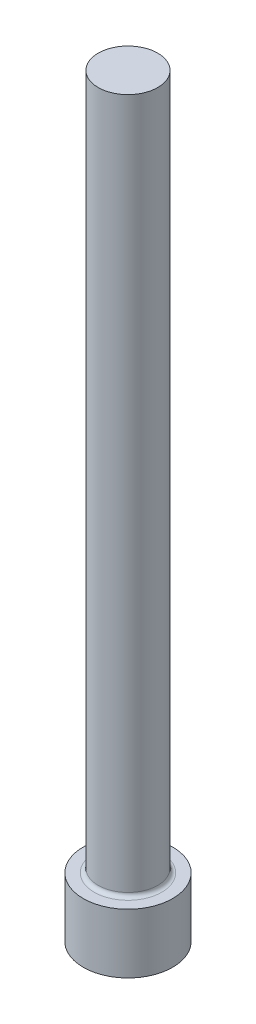
ISO-10303-21;
HEADER;
FILE_DESCRIPTION(('STEP AP214'),'2;1');
FILE_NAME('part.step','',(''),(''),'','','');
FILE_SCHEMA(('AUTOMOTIVE_DESIGN { 1 0 10303 214 1 1 1 1 }'));
ENDSEC;
DATA;
#1=APPLICATION_CONTEXT('core data for automotive mechanical design processes');
#2=APPLICATION_PROTOCOL_DEFINITION('international standard','automotive_design',2000,#1);
#3=PRODUCT_CONTEXT('',#1,'mechanical');
#4=PRODUCT('Part','Part','',(#3));
#5=PRODUCT_RELATED_PRODUCT_CATEGORY('part','',(#4));
#6=PRODUCT_DEFINITION_FORMATION('','',#4);
#7=PRODUCT_DEFINITION_CONTEXT('part definition',#1,'design');
#8=PRODUCT_DEFINITION('design','',#6,#7);
#9=PRODUCT_DEFINITION_SHAPE('','',#8);
#10=(LENGTH_UNIT() NAMED_UNIT(*) SI_UNIT(.MILLI.,.METRE.));
#11=(NAMED_UNIT(*) PLANE_ANGLE_UNIT() SI_UNIT($,.RADIAN.));
#12=(NAMED_UNIT(*) SI_UNIT($,.STERADIAN.) SOLID_ANGLE_UNIT());
#13=UNCERTAINTY_MEASURE_WITH_UNIT(LENGTH_MEASURE(1.E-05),#10,'distance_accuracy_value','');
#14=(GEOMETRIC_REPRESENTATION_CONTEXT(3) GLOBAL_UNCERTAINTY_ASSIGNED_CONTEXT((#13)) GLOBAL_UNIT_ASSIGNED_CONTEXT((#10,
#11,#12)) REPRESENTATION_CONTEXT('',''));
#15=CARTESIAN_POINT('',(0.,0.,0.));
#16=DIRECTION('',(0.,0.,1.));
#17=DIRECTION('',(1.,0.,0.));
#18=AXIS2_PLACEMENT_3D('',#15,#16,#17);
#19=CARTESIAN_POINT('',(0.,0.,0.));
#20=DIRECTION('',(0.,-1.,0.));
#21=DIRECTION('',(0.,0.,-1.));
#22=AXIS2_PLACEMENT_3D('',#19,#20,#21);
#23=PLANE('',#22);
#24=DIRECTION('',(-0.866025403784438,0.,0.5));
#25=VECTOR('',#24,1.);
#26=CARTESIAN_POINT('',(1.17,0.,0.675499814951862));
#27=LINE('',#26,#25);
#28=CARTESIAN_POINT('',(1.17,0.,0.675499814951862));
#29=VERTEX_POINT('',#28);
#30=CARTESIAN_POINT('',(0.,0.,1.35099962990372));
#31=VERTEX_POINT('',#30);
#32=EDGE_CURVE('E51',#29,#31,#27,.T.);
#33=ORIENTED_EDGE('',*,*,#32,.F.);
#34=DIRECTION('',(0.,0.,1.));
#35=VECTOR('',#34,1.);
#36=CARTESIAN_POINT('',(1.17,0.,-0.675499814951862));
#37=LINE('',#36,#35);
#38=CARTESIAN_POINT('',(1.17,0.,-0.675499814951862));
#39=VERTEX_POINT('',#38);
#40=EDGE_CURVE('E134',#39,#29,#37,.T.);
#41=ORIENTED_EDGE('',*,*,#40,.F.);
#42=DIRECTION('',(0.866025403784438,0.,0.5));
#43=VECTOR('',#42,1.);
#44=CARTESIAN_POINT('',(0.,0.,-1.35099962990372));
#45=LINE('',#44,#43);
#46=CARTESIAN_POINT('',(0.,0.,-1.35099962990372));
#47=VERTEX_POINT('',#46);
#48=EDGE_CURVE('E132',#47,#39,#45,.T.);
#49=ORIENTED_EDGE('',*,*,#48,.F.);
#50=DIRECTION('',(0.866025403784439,0.,-0.5));
#51=VECTOR('',#50,1.);
#52=CARTESIAN_POINT('',(-1.17,0.,-0.675499814951862));
#53=LINE('',#52,#51);
#54=CARTESIAN_POINT('',(-1.17,0.,-0.675499814951862));
#55=VERTEX_POINT('',#54);
#56=EDGE_CURVE('E99',#55,#47,#53,.T.);
#57=ORIENTED_EDGE('',*,*,#56,.F.);
#58=DIRECTION('',(0.,0.,-1.));
#59=VECTOR('',#58,1.);
#60=CARTESIAN_POINT('',(-1.17,0.,0.675499814951862));
#61=LINE('',#60,#59);
#62=CARTESIAN_POINT('',(-1.17,0.,0.675499814951862));
#63=VERTEX_POINT('',#62);
#64=EDGE_CURVE('E128',#63,#55,#61,.T.);
#65=ORIENTED_EDGE('',*,*,#64,.F.);
#66=DIRECTION('',(-0.866025403784439,0.,-0.5));
#67=VECTOR('',#66,1.);
#68=CARTESIAN_POINT('',(0.,0.,1.35099962990372));
#69=LINE('',#68,#67);
#70=EDGE_CURVE('E125',#31,#63,#69,.T.);
#71=ORIENTED_EDGE('',*,*,#70,.F.);
#72=EDGE_LOOP('',(#33,#41,#49,#57,#65,#71));
#73=FACE_BOUND('',#72,.T.);
#74=CARTESIAN_POINT('',(0.,0.,0.));
#75=DIRECTION('',(0.,1.,0.));
#76=DIRECTION('',(0.,0.,1.));
#77=AXIS2_PLACEMENT_3D('',#74,#75,#76);
#78=CIRCLE('',#77,2.25);
#79=CARTESIAN_POINT('',(0.,0.,2.25));
#80=VERTEX_POINT('',#79);
#81=EDGE_CURVE('E149',#80,#80,#78,.T.);
#82=ORIENTED_EDGE('',*,*,#81,.F.);
#83=EDGE_LOOP('',(#82));
#84=FACE_BOUND('',#83,.T.);
#85=ADVANCED_FACE('F36',(#73,#84),#23,.T.);
#86=CARTESIAN_POINT('',(0.,38.,0.));
#87=DIRECTION('',(0.,1.,0.));
#88=DIRECTION('',(0.,0.,1.));
#89=AXIS2_PLACEMENT_3D('',#86,#87,#88);
#90=CYLINDRICAL_SURFACE('',#89,2.25);
#91=ORIENTED_EDGE('',*,*,#81,.T.);
#92=EDGE_LOOP('',(#91));
#93=FACE_BOUND('',#92,.T.);
#94=CARTESIAN_POINT('',(0.,3.,0.));
#95=DIRECTION('',(0.,1.,0.));
#96=DIRECTION('',(0.,0.,1.));
#97=AXIS2_PLACEMENT_3D('',#94,#95,#96);
#98=CIRCLE('',#97,2.25);
#99=CARTESIAN_POINT('',(0.,3.,2.25));
#100=VERTEX_POINT('',#99);
#101=EDGE_CURVE('E146',#100,#100,#98,.T.);
#102=ORIENTED_EDGE('',*,*,#101,.F.);
#103=EDGE_LOOP('',(#102));
#104=FACE_BOUND('',#103,.T.);
#105=ADVANCED_FACE('F171',(#93,#104),#90,.T.);
#106=CARTESIAN_POINT('',(0.,3.,2.25));
#107=DIRECTION('',(0.,1.,0.));
#108=DIRECTION('',(0.,0.,1.));
#109=AXIS2_PLACEMENT_3D('',#106,#107,#108);
#110=PLANE('',#109);
#111=CARTESIAN_POINT('',(0.,3.,0.));
#112=DIRECTION('',(0.,1.,0.));
#113=DIRECTION('',(0.,0.,1.));
#114=AXIS2_PLACEMENT_3D('',#111,#112,#113);
#115=CIRCLE('',#114,1.7);
#116=CARTESIAN_POINT('',(0.,3.,1.7));
#117=VERTEX_POINT('',#116);
#118=EDGE_CURVE('E11',#117,#117,#115,.F.);
#119=ORIENTED_EDGE('',*,*,#118,.T.);
#120=EDGE_LOOP('',(#119));
#121=FACE_BOUND('',#120,.T.);
#122=ORIENTED_EDGE('',*,*,#101,.T.);
#123=EDGE_LOOP('',(#122));
#124=FACE_BOUND('',#123,.T.);
#125=ADVANCED_FACE('F176',(#121,#124),#110,.T.);
#126=CARTESIAN_POINT('',(0.,38.,0.));
#127=DIRECTION('',(0.,1.,0.));
#128=DIRECTION('',(0.,0.,1.));
#129=AXIS2_PLACEMENT_3D('',#126,#127,#128);
#130=CYLINDRICAL_SURFACE('',#129,1.5);
#131=CARTESIAN_POINT('',(0.,3.2,0.));
#132=DIRECTION('',(0.,1.,0.));
#133=DIRECTION('',(0.,0.,1.));
#134=AXIS2_PLACEMENT_3D('',#131,#132,#133);
#135=CIRCLE('',#134,1.5);
#136=CARTESIAN_POINT('',(0.,3.2,1.5));
#137=VERTEX_POINT('',#136);
#138=EDGE_CURVE('E44',#137,#137,#135,.T.);
#139=ORIENTED_EDGE('',*,*,#138,.T.);
#140=EDGE_LOOP('',(#139));
#141=FACE_BOUND('',#140,.T.);
#142=CARTESIAN_POINT('',(0.,38.,0.));
#143=DIRECTION('',(0.,1.,0.));
#144=DIRECTION('',(0.,0.,1.));
#145=AXIS2_PLACEMENT_3D('',#142,#143,#144);
#146=CIRCLE('',#145,1.5);
#147=CARTESIAN_POINT('',(0.,38.,1.5));
#148=VERTEX_POINT('',#147);
#149=EDGE_CURVE('E138',#148,#148,#146,.T.);
#150=ORIENTED_EDGE('',*,*,#149,.F.);
#151=EDGE_LOOP('',(#150));
#152=FACE_BOUND('',#151,.T.);
#153=ADVANCED_FACE('F154',(#141,#152),#130,.T.);
#154=CARTESIAN_POINT('',(0.,38.,1.5));
#155=DIRECTION('',(0.,1.,0.));
#156=DIRECTION('',(0.,0.,1.));
#157=AXIS2_PLACEMENT_3D('',#154,#155,#156);
#158=PLANE('',#157);
#159=ORIENTED_EDGE('',*,*,#149,.T.);
#160=EDGE_LOOP('',(#159));
#161=FACE_BOUND('',#160,.T.);
#162=ADVANCED_FACE('F159',(#161),#158,.T.);
#163=CARTESIAN_POINT('',(0.,3.2,0.));
#164=DIRECTION('',(0.,1.,0.));
#165=DIRECTION('',(0.,0.,1.));
#166=AXIS2_PLACEMENT_3D('',#163,#164,#165);
#167=TOROIDAL_SURFACE('',#166,1.7,0.2);
#168=ORIENTED_EDGE('',*,*,#118,.F.);
#169=EDGE_LOOP('',(#168));
#170=FACE_BOUND('',#169,.T.);
#171=ORIENTED_EDGE('',*,*,#138,.F.);
#172=EDGE_LOOP('',(#171));
#173=FACE_BOUND('',#172,.T.);
#174=ADVANCED_FACE('F38',(#170,#173),#167,.F.);
#175=CARTESIAN_POINT('',(1.17,1.5,0.675499814951862));
#176=DIRECTION('',(0.5,0.,0.866025403784439));
#177=DIRECTION('',(0.866025403784439,0.,-0.5));
#178=AXIS2_PLACEMENT_3D('',#175,#176,#177);
#179=PLANE('',#178);
#180=ORIENTED_EDGE('',*,*,#32,.T.);
#181=DIRECTION('',(0.,-1.,0.));
#182=VECTOR('',#181,1.);
#183=CARTESIAN_POINT('',(0.,1.5,1.35099962990373));
#184=LINE('',#183,#182);
#185=CARTESIAN_POINT('',(0.,1.5,1.35099962990373));
#186=VERTEX_POINT('',#185);
#187=EDGE_CURVE('E81',#186,#31,#184,.T.);
#188=ORIENTED_EDGE('',*,*,#187,.F.);
#189=DIRECTION('',(-0.866025403784438,0.,0.5));
#190=VECTOR('',#189,1.);
#191=CARTESIAN_POINT('',(1.17,1.5,0.675499814951862));
#192=LINE('',#191,#190);
#193=CARTESIAN_POINT('',(1.17,1.5,0.675499814951862));
#194=VERTEX_POINT('',#193);
#195=EDGE_CURVE('E136',#194,#186,#192,.T.);
#196=ORIENTED_EDGE('',*,*,#195,.F.);
#197=DIRECTION('',(0.,-1.,0.));
#198=VECTOR('',#197,1.);
#199=CARTESIAN_POINT('',(1.17,1.5,0.675499814951862));
#200=LINE('',#199,#198);
#201=EDGE_CURVE('E59',#194,#29,#200,.T.);
#202=ORIENTED_EDGE('',*,*,#201,.T.);
#203=EDGE_LOOP('',(#180,#188,#196,#202));
#204=FACE_BOUND('',#203,.T.);
#205=ADVANCED_FACE('F158',(#204),#179,.F.);
#206=CARTESIAN_POINT('',(1.17,1.5,-0.675499814951862));
#207=DIRECTION('',(1.,0.,0.));
#208=DIRECTION('',(0.,0.,-1.));
#209=AXIS2_PLACEMENT_3D('',#206,#207,#208);
#210=PLANE('',#209);
#211=ORIENTED_EDGE('',*,*,#40,.T.);
#212=ORIENTED_EDGE('',*,*,#201,.F.);
#213=DIRECTION('',(0.,0.,1.));
#214=VECTOR('',#213,1.);
#215=CARTESIAN_POINT('',(1.17,1.5,-0.675499814951862));
#216=LINE('',#215,#214);
#217=CARTESIAN_POINT('',(1.17,1.5,-0.675499814951862));
#218=VERTEX_POINT('',#217);
#219=EDGE_CURVE('E111',#218,#194,#216,.T.);
#220=ORIENTED_EDGE('',*,*,#219,.F.);
#221=DIRECTION('',(0.,-1.,0.));
#222=VECTOR('',#221,1.);
#223=CARTESIAN_POINT('',(1.17,1.5,-0.675499814951862));
#224=LINE('',#223,#222);
#225=EDGE_CURVE('E103',#218,#39,#224,.T.);
#226=ORIENTED_EDGE('',*,*,#225,.T.);
#227=EDGE_LOOP('',(#211,#212,#220,#226));
#228=FACE_BOUND('',#227,.T.);
#229=ADVANCED_FACE('F165',(#228),#210,.F.);
#230=CARTESIAN_POINT('',(0.,1.5,-1.35099962990372));
#231=DIRECTION('',(0.5,0.,-0.866025403784439));
#232=DIRECTION('',(-0.866025403784439,0.,-0.5));
#233=AXIS2_PLACEMENT_3D('',#230,#231,#232);
#234=PLANE('',#233);
#235=ORIENTED_EDGE('',*,*,#48,.T.);
#236=ORIENTED_EDGE('',*,*,#225,.F.);
#237=DIRECTION('',(0.866025403784438,0.,0.5));
#238=VECTOR('',#237,1.);
#239=CARTESIAN_POINT('',(0.,1.5,-1.35099962990372));
#240=LINE('',#239,#238);
#241=CARTESIAN_POINT('',(0.,1.5,-1.35099962990372));
#242=VERTEX_POINT('',#241);
#243=EDGE_CURVE('E107',#242,#218,#240,.T.);
#244=ORIENTED_EDGE('',*,*,#243,.F.);
#245=DIRECTION('',(0.,-1.,0.));
#246=VECTOR('',#245,1.);
#247=CARTESIAN_POINT('',(0.,1.5,-1.35099962990372));
#248=LINE('',#247,#246);
#249=EDGE_CURVE('E92',#242,#47,#248,.T.);
#250=ORIENTED_EDGE('',*,*,#249,.T.);
#251=EDGE_LOOP('',(#235,#236,#244,#250));
#252=FACE_BOUND('',#251,.T.);
#253=ADVANCED_FACE('F108',(#252),#234,.F.);
#254=CARTESIAN_POINT('',(-1.17,1.5,-0.675499814951862));
#255=DIRECTION('',(-0.5,0.,-0.866025403784438));
#256=DIRECTION('',(-0.866025403784439,0.,0.5));
#257=AXIS2_PLACEMENT_3D('',#254,#255,#256);
#258=PLANE('',#257);
#259=ORIENTED_EDGE('',*,*,#56,.T.);
#260=ORIENTED_EDGE('',*,*,#249,.F.);
#261=DIRECTION('',(0.866025403784439,0.,-0.5));
#262=VECTOR('',#261,1.);
#263=CARTESIAN_POINT('',(-1.17,1.5,-0.675499814951862));
#264=LINE('',#263,#262);
#265=CARTESIAN_POINT('',(-1.17,1.5,-0.675499814951862));
#266=VERTEX_POINT('',#265);
#267=EDGE_CURVE('E96',#266,#242,#264,.T.);
#268=ORIENTED_EDGE('',*,*,#267,.F.);
#269=DIRECTION('',(0.,-1.,0.));
#270=VECTOR('',#269,1.);
#271=CARTESIAN_POINT('',(-1.17,1.5,-0.675499814951862));
#272=LINE('',#271,#270);
#273=EDGE_CURVE('E104',#266,#55,#272,.T.);
#274=ORIENTED_EDGE('',*,*,#273,.T.);
#275=EDGE_LOOP('',(#259,#260,#268,#274));
#276=FACE_BOUND('',#275,.T.);
#277=ADVANCED_FACE('F94',(#276),#258,.F.);
#278=CARTESIAN_POINT('',(-1.17,1.5,0.675499814951862));
#279=DIRECTION('',(-1.,0.,0.));
#280=DIRECTION('',(0.,0.,1.));
#281=AXIS2_PLACEMENT_3D('',#278,#279,#280);
#282=PLANE('',#281);
#283=ORIENTED_EDGE('',*,*,#64,.T.);
#284=ORIENTED_EDGE('',*,*,#273,.F.);
#285=DIRECTION('',(0.,0.,-1.));
#286=VECTOR('',#285,1.);
#287=CARTESIAN_POINT('',(-1.17,1.5,0.675499814951862));
#288=LINE('',#287,#286);
#289=CARTESIAN_POINT('',(-1.17,1.5,0.675499814951862));
#290=VERTEX_POINT('',#289);
#291=EDGE_CURVE('E117',#290,#266,#288,.T.);
#292=ORIENTED_EDGE('',*,*,#291,.F.);
#293=DIRECTION('',(0.,-1.,0.));
#294=VECTOR('',#293,1.);
#295=CARTESIAN_POINT('',(-1.17,1.5,0.675499814951862));
#296=LINE('',#295,#294);
#297=EDGE_CURVE('E141',#290,#63,#296,.T.);
#298=ORIENTED_EDGE('',*,*,#297,.T.);
#299=EDGE_LOOP('',(#283,#284,#292,#298));
#300=FACE_BOUND('',#299,.T.);
#301=ADVANCED_FACE('F189',(#300),#282,.F.);
#302=CARTESIAN_POINT('',(0.,1.5,1.35099962990373));
#303=DIRECTION('',(-0.5,0.,0.866025403784438));
#304=DIRECTION('',(0.866025403784439,0.,0.5));
#305=AXIS2_PLACEMENT_3D('',#302,#303,#304);
#306=PLANE('',#305);
#307=ORIENTED_EDGE('',*,*,#70,.T.);
#308=ORIENTED_EDGE('',*,*,#297,.F.);
#309=DIRECTION('',(-0.866025403784439,0.,-0.5));
#310=VECTOR('',#309,1.);
#311=CARTESIAN_POINT('',(0.,1.5,1.35099962990373));
#312=LINE('',#311,#310);
#313=EDGE_CURVE('E119',#186,#290,#312,.T.);
#314=ORIENTED_EDGE('',*,*,#313,.F.);
#315=ORIENTED_EDGE('',*,*,#187,.T.);
#316=EDGE_LOOP('',(#307,#308,#314,#315));
#317=FACE_BOUND('',#316,.T.);
#318=ADVANCED_FACE('F186',(#317),#306,.F.);
#319=CARTESIAN_POINT('',(0.,1.5,0.));
#320=DIRECTION('',(0.,-1.,0.));
#321=DIRECTION('',(0.,0.,-1.));
#322=AXIS2_PLACEMENT_3D('',#319,#320,#321);
#323=PLANE('',#322);
#324=ORIENTED_EDGE('',*,*,#195,.T.);
#325=ORIENTED_EDGE('',*,*,#313,.T.);
#326=ORIENTED_EDGE('',*,*,#291,.T.);
#327=ORIENTED_EDGE('',*,*,#267,.T.);
#328=ORIENTED_EDGE('',*,*,#243,.T.);
#329=ORIENTED_EDGE('',*,*,#219,.T.);
#330=EDGE_LOOP('',(#324,#325,#326,#327,#328,#329));
#331=FACE_BOUND('',#330,.T.);
#332=ADVANCED_FACE('F114',(#331),#323,.T.);
#333=CLOSED_SHELL('',(#85,#105,#125,#153,#162,#174,#205,#229,#253,#277,#301,#318,#332));
#334=MANIFOLD_SOLID_BREP('B2',#333);
#335=ADVANCED_BREP_SHAPE_REPRESENTATION('',(#18,#334),#14);
#336=SHAPE_DEFINITION_REPRESENTATION(#9,#335);
ENDSEC;
END-ISO-10303-21;
